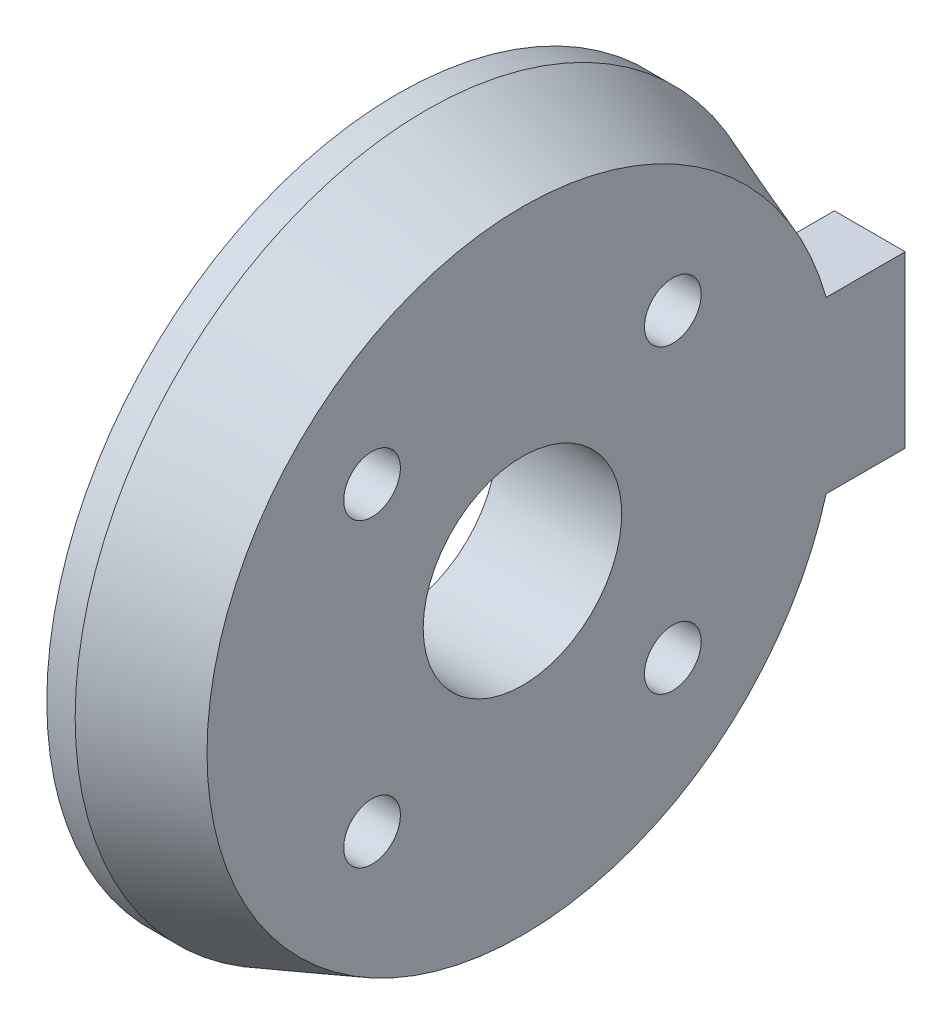
ISO-10303-21;
HEADER;
FILE_DESCRIPTION(('STEP AP214'),'2;1');
FILE_NAME('part.step','',(''),(''),'','','');
FILE_SCHEMA(('AUTOMOTIVE_DESIGN { 1 0 10303 214 1 1 1 1 }'));
ENDSEC;
DATA;
#1=APPLICATION_CONTEXT('core data for automotive mechanical design processes');
#2=APPLICATION_PROTOCOL_DEFINITION('international standard','automotive_design',2000,#1);
#3=PRODUCT_CONTEXT('',#1,'mechanical');
#4=PRODUCT('Part','Part','',(#3));
#5=PRODUCT_RELATED_PRODUCT_CATEGORY('part','',(#4));
#6=PRODUCT_DEFINITION_FORMATION('','',#4);
#7=PRODUCT_DEFINITION_CONTEXT('part definition',#1,'design');
#8=PRODUCT_DEFINITION('design','',#6,#7);
#9=PRODUCT_DEFINITION_SHAPE('','',#8);
#10=(LENGTH_UNIT() NAMED_UNIT(*) SI_UNIT(.MILLI.,.METRE.));
#11=(NAMED_UNIT(*) PLANE_ANGLE_UNIT() SI_UNIT($,.RADIAN.));
#12=(NAMED_UNIT(*) SI_UNIT($,.STERADIAN.) SOLID_ANGLE_UNIT());
#13=UNCERTAINTY_MEASURE_WITH_UNIT(LENGTH_MEASURE(1.E-05),#10,'distance_accuracy_value','');
#14=(GEOMETRIC_REPRESENTATION_CONTEXT(3) GLOBAL_UNCERTAINTY_ASSIGNED_CONTEXT((#13)) GLOBAL_UNIT_ASSIGNED_CONTEXT((#10,
#11,#12)) REPRESENTATION_CONTEXT('',''));
#15=CARTESIAN_POINT('',(0.,0.,0.));
#16=DIRECTION('',(0.,0.,1.));
#17=DIRECTION('',(1.,0.,0.));
#18=AXIS2_PLACEMENT_3D('',#15,#16,#17);
#19=CARTESIAN_POINT('',(0.,7.,0.));
#20=DIRECTION('',(1.,0.,0.));
#21=DIRECTION('',(0.,0.,-1.));
#22=AXIS2_PLACEMENT_3D('',#19,#20,#21);
#23=PLANE('',#22);
#24=CARTESIAN_POINT('',(0.,0.,0.));
#25=DIRECTION('',(-1.,0.,0.));
#26=DIRECTION('',(0.,0.,1.));
#27=AXIS2_PLACEMENT_3D('',#24,#25,#26);
#28=CIRCLE('',#27,7.);
#29=CARTESIAN_POINT('',(0.,0.,7.));
#30=VERTEX_POINT('',#29);
#31=EDGE_CURVE('E537',#30,#30,#28,.T.);
#32=ORIENTED_EDGE('',*,*,#31,.F.);
#33=EDGE_LOOP('',(#32));
#34=FACE_BOUND('',#33,.T.);
#35=CARTESIAN_POINT('',(0.,0.,0.));
#36=DIRECTION('',(-1.,0.,0.));
#37=DIRECTION('',(0.,0.,1.));
#38=AXIS2_PLACEMENT_3D('',#35,#36,#37);
#39=CIRCLE('',#38,24.75);
#40=CARTESIAN_POINT('',(0.,0.,24.75));
#41=VERTEX_POINT('',#40);
#42=EDGE_CURVE('E386',#41,#41,#39,.T.);
#43=ORIENTED_EDGE('',*,*,#42,.T.);
#44=EDGE_LOOP('',(#43));
#45=FACE_BOUND('',#44,.T.);
#46=ADVANCED_FACE('F378',(#34,#45),#23,.F.);
#47=CARTESIAN_POINT('',(0.,0.,0.));
#48=DIRECTION('',(-1.,0.,0.));
#49=DIRECTION('',(0.,0.,1.));
#50=AXIS2_PLACEMENT_3D('',#47,#48,#49);
#51=CYLINDRICAL_SURFACE('',#50,24.75);
#52=ORIENTED_EDGE('',*,*,#42,.F.);
#53=EDGE_LOOP('',(#52));
#54=FACE_BOUND('',#53,.T.);
#55=CARTESIAN_POINT('',(2.,0.,0.));
#56=DIRECTION('',(-1.,0.,0.));
#57=DIRECTION('',(0.,0.,1.));
#58=AXIS2_PLACEMENT_3D('',#55,#56,#57);
#59=CIRCLE('',#58,24.75);
#60=CARTESIAN_POINT('',(2.,0.,24.75));
#61=VERTEX_POINT('',#60);
#62=EDGE_CURVE('E541',#61,#61,#59,.T.);
#63=ORIENTED_EDGE('',*,*,#62,.T.);
#64=EDGE_LOOP('',(#63));
#65=FACE_BOUND('',#64,.T.);
#66=ADVANCED_FACE('F526',(#54,#65),#51,.T.);
#67=CARTESIAN_POINT('',(8.8,0.,0.));
#68=DIRECTION('',(-1.,0.,0.));
#69=DIRECTION('',(0.,0.,1.));
#70=AXIS2_PLACEMENT_3D('',#67,#68,#69);
#71=CONICAL_SURFACE('',#70,22.25,0.352308724674142);
#72=CARTESIAN_POINT('',(8.8,0.,0.));
#73=DIRECTION('',(-1.,0.,0.));
#74=DIRECTION('',(0.,0.,1.));
#75=AXIS2_PLACEMENT_3D('',#72,#73,#74);
#76=CIRCLE('',#75,22.25);
#77=CARTESIAN_POINT('',(8.8,-6.,-21.4257438610658));
#78=VERTEX_POINT('',#77);
#79=CARTESIAN_POINT('',(8.8,6.,-21.4257438610658));
#80=VERTEX_POINT('',#79);
#81=EDGE_CURVE('E545',#78,#80,#76,.T.);
#82=ORIENTED_EDGE('',*,*,#81,.T.);
#83=CARTESIAN_POINT('',(19.7575035004056,6.,-17.2053271783559));
#84=CARTESIAN_POINT('',(18.6390342026549,6.,-17.6407847721388));
#85=CARTESIAN_POINT('',(17.5199812225312,6.,-18.0747394632597));
#86=CARTESIAN_POINT('',(15.2809016229607,6.,-18.9401247539898));
#87=CARTESIAN_POINT('',(14.1608750051132,6.,-19.3715553577363));
#88=CARTESIAN_POINT('',(11.9200463267099,6.,-20.2323724852754));
#89=CARTESIAN_POINT('',(10.7992442718469,6.,-20.661759023896));
#90=CARTESIAN_POINT('',(8.55698840045047,6.,-21.5188280809643));
#91=CARTESIAN_POINT('',(7.43553458361437,6.,-21.9465105986202));
#92=CARTESIAN_POINT('',(4.0703735247917,6.,-23.2274248495122));
#93=CARTESIAN_POINT('',(1.8258557930731,6.,-24.078527454133));
#94=CARTESIAN_POINT('',(-1.54209414362676,6.,-25.3521000782523));
#95=CARTESIAN_POINT('',(-2.66494389793727,6.,-25.7761123256828));
#96=CARTESIAN_POINT('',(-4.91098204274209,6.,-26.6232384360108));
#97=CARTESIAN_POINT('',(-6.03417043317763,6.,-27.0463522990641));
#98=CARTESIAN_POINT('',(-7.15750350040557,6.,-27.4690819374392));
#99=B_SPLINE_CURVE_WITH_KNOTS('',3,(#83,#84,#85,#86,#87,#88,#89,#90,#91,#92,#93,#94,#95,#96,#97,
#98),.UNSPECIFIED.,.F.,.F.,(4,2,2,2,2,2,2,4),(0.,3.60074299673403,7.2014800898162,
10.8021910228473,14.4029036291149,21.604293878824,25.2050160476806,28.8057375920593),.UNSPECIFIED.);
#100=CARTESIAN_POINT('',(3.8,6.,-23.3290179730047));
#101=VERTEX_POINT('',#100);
#102=EDGE_CURVE('E396',#80,#101,#99,.T.);
#103=ORIENTED_EDGE('',*,*,#102,.T.);
#104=CARTESIAN_POINT('',(3.8,0.,0.));
#105=DIRECTION('',(1.,0.,0.));
#106=DIRECTION('',(0.,0.,-1.));
#107=AXIS2_PLACEMENT_3D('',#104,#105,#106);
#108=CIRCLE('',#107,24.0882352941176);
#109=CARTESIAN_POINT('',(3.8,-6.,-23.3290179730047));
#110=VERTEX_POINT('',#109);
#111=EDGE_CURVE('E12',#110,#101,#108,.T.);
#112=ORIENTED_EDGE('',*,*,#111,.F.);
#113=CARTESIAN_POINT('',(-7.15750350040557,-6.,-27.4690819374392));
#114=CARTESIAN_POINT('',(-6.03417043317763,-6.,-27.0463522990641));
#115=CARTESIAN_POINT('',(-4.9109820427421,-6.,-26.6232384360108));
#116=CARTESIAN_POINT('',(-2.66494389793727,-6.,-25.7761123256828));
#117=CARTESIAN_POINT('',(-1.54209414362675,-6.,-25.3521000782523));
#118=CARTESIAN_POINT('',(1.82585579307311,-6.,-24.078527454133));
#119=CARTESIAN_POINT('',(4.0703735247917,-6.,-23.2274248495122));
#120=CARTESIAN_POINT('',(7.43553458361437,-6.,-21.9465105986202));
#121=CARTESIAN_POINT('',(8.55698840045047,-6.,-21.5188280809643));
#122=CARTESIAN_POINT('',(10.7992442718469,-6.,-20.661759023896));
#123=CARTESIAN_POINT('',(11.9200463267099,-6.,-20.2323724852754));
#124=CARTESIAN_POINT('',(14.1608750051132,-6.,-19.3715553577363));
#125=CARTESIAN_POINT('',(15.2809016229607,-6.,-18.9401247539898));
#126=CARTESIAN_POINT('',(17.5199812225312,-6.,-18.0747394632597));
#127=CARTESIAN_POINT('',(18.6390342026549,-6.,-17.6407847721388));
#128=CARTESIAN_POINT('',(19.7575035004056,-6.,-17.2053271783559));
#129=B_SPLINE_CURVE_WITH_KNOTS('',3,(#113,#114,#115,#116,#117,#118,#119,#120,#121,#122,#123,
#124,#125,#126,#127,#128),.UNSPECIFIED.,.F.,.F.,(4,2,2,2,2,2,2,4),(0.,3.60072154437864,
7.2014437132353,14.4028339629443,18.003546569212,21.6042575022431,25.2049945953252,
28.8057375920593),.UNSPECIFIED.);
#130=EDGE_CURVE('E429',#110,#78,#129,.T.);
#131=ORIENTED_EDGE('',*,*,#130,.T.);
#132=EDGE_LOOP('',(#82,#103,#112,#131));
#133=FACE_BOUND('',#132,.T.);
#134=ORIENTED_EDGE('',*,*,#62,.F.);
#135=EDGE_LOOP('',(#134));
#136=FACE_BOUND('',#135,.T.);
#137=ADVANCED_FACE('F477',(#133,#136),#71,.T.);
#138=CARTESIAN_POINT('',(8.8,22.25,0.));
#139=DIRECTION('',(-1.,0.,0.));
#140=DIRECTION('',(0.,0.,1.));
#141=AXIS2_PLACEMENT_3D('',#138,#139,#140);
#142=PLANE('',#141);
#143=ORIENTED_EDGE('',*,*,#81,.F.);
#144=DIRECTION('',(0.,0.,-1.));
#145=VECTOR('',#144,1.);
#146=CARTESIAN_POINT('',(8.8,-6.,-15.));
#147=LINE('',#146,#145);
#148=CARTESIAN_POINT('',(8.8,-6.,-27.));
#149=VERTEX_POINT('',#148);
#150=EDGE_CURVE('E454',#78,#149,#147,.T.);
#151=ORIENTED_EDGE('',*,*,#150,.T.);
#152=DIRECTION('',(0.,1.,0.));
#153=VECTOR('',#152,1.);
#154=CARTESIAN_POINT('',(8.8,6.,-27.));
#155=LINE('',#154,#153);
#156=CARTESIAN_POINT('',(8.8,6.,-27.));
#157=VERTEX_POINT('',#156);
#158=EDGE_CURVE('E441',#149,#157,#155,.T.);
#159=ORIENTED_EDGE('',*,*,#158,.T.);
#160=DIRECTION('',(0.,0.,1.));
#161=VECTOR('',#160,1.);
#162=CARTESIAN_POINT('',(8.8,6.,-15.));
#163=LINE('',#162,#161);
#164=EDGE_CURVE('E434',#157,#80,#163,.T.);
#165=ORIENTED_EDGE('',*,*,#164,.T.);
#166=EDGE_LOOP('',(#143,#151,#159,#165));
#167=FACE_BOUND('',#166,.T.);
#168=CARTESIAN_POINT('',(8.8,10.6066017177976,10.6066017177982));
#169=DIRECTION('',(1.,0.,0.));
#170=DIRECTION('',(0.,0.,-1.));
#171=AXIS2_PLACEMENT_3D('',#168,#169,#170);
#172=CIRCLE('',#171,2.00000000000064);
#173=CARTESIAN_POINT('',(8.8,10.6066017177976,8.60660171779759));
#174=VERTEX_POINT('',#173);
#175=EDGE_CURVE('E568',#174,#174,#172,.T.);
#176=ORIENTED_EDGE('',*,*,#175,.F.);
#177=EDGE_LOOP('',(#176));
#178=FACE_BOUND('',#177,.T.);
#179=CARTESIAN_POINT('',(8.8,-10.6066017177988,10.6066017177976));
#180=DIRECTION('',(1.,0.,0.));
#181=DIRECTION('',(0.,0.,-1.));
#182=AXIS2_PLACEMENT_3D('',#179,#180,#181);
#183=CIRCLE('',#182,2.00000000000045);
#184=CARTESIAN_POINT('',(8.8,-10.6066017177988,8.60660171779715));
#185=VERTEX_POINT('',#184);
#186=EDGE_CURVE('E576',#185,#185,#183,.T.);
#187=ORIENTED_EDGE('',*,*,#186,.F.);
#188=EDGE_LOOP('',(#187));
#189=FACE_BOUND('',#188,.T.);
#190=CARTESIAN_POINT('',(8.8,-10.6066017177982,-10.6066017177988));
#191=DIRECTION('',(1.,0.,0.));
#192=DIRECTION('',(0.,0.,-1.));
#193=AXIS2_PLACEMENT_3D('',#190,#191,#192);
#194=CIRCLE('',#193,1.99999999999985);
#195=CARTESIAN_POINT('',(8.8,-10.6066017177982,-12.6066017177987));
#196=VERTEX_POINT('',#195);
#197=EDGE_CURVE('E561',#196,#196,#194,.T.);
#198=ORIENTED_EDGE('',*,*,#197,.F.);
#199=EDGE_LOOP('',(#198));
#200=FACE_BOUND('',#199,.T.);
#201=CARTESIAN_POINT('',(8.8,10.6066017177982,-10.6066017177982));
#202=DIRECTION('',(1.,0.,0.));
#203=DIRECTION('',(0.,0.,-1.));
#204=AXIS2_PLACEMENT_3D('',#201,#202,#203);
#205=CIRCLE('',#204,2.);
#206=CARTESIAN_POINT('',(8.8,10.6066017177982,-12.6066017177982));
#207=VERTEX_POINT('',#206);
#208=EDGE_CURVE('E557',#207,#207,#205,.T.);
#209=ORIENTED_EDGE('',*,*,#208,.F.);
#210=EDGE_LOOP('',(#209));
#211=FACE_BOUND('',#210,.T.);
#212=CARTESIAN_POINT('',(8.8,0.,0.));
#213=DIRECTION('',(-1.,0.,0.));
#214=DIRECTION('',(0.,0.,1.));
#215=AXIS2_PLACEMENT_3D('',#212,#213,#214);
#216=CIRCLE('',#215,7.);
#217=CARTESIAN_POINT('',(8.8,0.,7.));
#218=VERTEX_POINT('',#217);
#219=EDGE_CURVE('E550',#218,#218,#216,.T.);
#220=ORIENTED_EDGE('',*,*,#219,.T.);
#221=EDGE_LOOP('',(#220));
#222=FACE_BOUND('',#221,.T.);
#223=ADVANCED_FACE('F519',(#167,#178,#189,#200,#211,#222),#142,.F.);
#224=CARTESIAN_POINT('',(0.,0.,0.));
#225=DIRECTION('',(-1.,0.,0.));
#226=DIRECTION('',(0.,0.,1.));
#227=AXIS2_PLACEMENT_3D('',#224,#225,#226);
#228=CYLINDRICAL_SURFACE('',#227,7.);
#229=ORIENTED_EDGE('',*,*,#219,.F.);
#230=EDGE_LOOP('',(#229));
#231=FACE_BOUND('',#230,.T.);
#232=ORIENTED_EDGE('',*,*,#31,.T.);
#233=EDGE_LOOP('',(#232));
#234=FACE_BOUND('',#233,.T.);
#235=ADVANCED_FACE('F516',(#231,#234),#228,.F.);
#236=CARTESIAN_POINT('',(3.8,10.6066017177982,-10.6066017177982));
#237=DIRECTION('',(1.,0.,0.));
#238=DIRECTION('',(0.,0.,-1.));
#239=AXIS2_PLACEMENT_3D('',#236,#237,#238);
#240=CYLINDRICAL_SURFACE('',#239,2.);
#241=CARTESIAN_POINT('',(3.8,10.6066017177982,-10.6066017177982));
#242=DIRECTION('',(1.,0.,0.));
#243=DIRECTION('',(0.,0.,-1.));
#244=AXIS2_PLACEMENT_3D('',#241,#242,#243);
#245=CIRCLE('',#244,2.);
#246=CARTESIAN_POINT('',(3.8,10.6066017177982,-12.6066017177982));
#247=VERTEX_POINT('',#246);
#248=EDGE_CURVE('E556',#247,#247,#245,.T.);
#249=ORIENTED_EDGE('',*,*,#248,.F.);
#250=EDGE_LOOP('',(#249));
#251=FACE_BOUND('',#250,.T.);
#252=ORIENTED_EDGE('',*,*,#208,.T.);
#253=EDGE_LOOP('',(#252));
#254=FACE_BOUND('',#253,.T.);
#255=ADVANCED_FACE('F512',(#251,#254),#240,.F.);
#256=CARTESIAN_POINT('',(3.8,10.6066017177982,-10.6066017177982));
#257=DIRECTION('',(1.,0.,0.));
#258=DIRECTION('',(0.,0.,-1.));
#259=AXIS2_PLACEMENT_3D('',#256,#257,#258);
#260=PLANE('',#259);
#261=ORIENTED_EDGE('',*,*,#248,.T.);
#262=EDGE_LOOP('',(#261));
#263=FACE_BOUND('',#262,.T.);
#264=ADVANCED_FACE('F489',(#263),#260,.T.);
#265=CARTESIAN_POINT('',(3.8,-10.6066017177982,-10.6066017177988));
#266=DIRECTION('',(1.,0.,0.));
#267=DIRECTION('',(0.,0.,-1.));
#268=AXIS2_PLACEMENT_3D('',#265,#266,#267);
#269=CYLINDRICAL_SURFACE('',#268,1.99999999999985);
#270=CARTESIAN_POINT('',(3.8,-10.6066017177982,-10.6066017177988));
#271=DIRECTION('',(1.,0.,0.));
#272=DIRECTION('',(0.,0.,-1.));
#273=AXIS2_PLACEMENT_3D('',#270,#271,#272);
#274=CIRCLE('',#273,1.99999999999985);
#275=CARTESIAN_POINT('',(3.8,-10.6066017177982,-12.6066017177987));
#276=VERTEX_POINT('',#275);
#277=EDGE_CURVE('E580',#276,#276,#274,.T.);
#278=ORIENTED_EDGE('',*,*,#277,.F.);
#279=EDGE_LOOP('',(#278));
#280=FACE_BOUND('',#279,.T.);
#281=ORIENTED_EDGE('',*,*,#197,.T.);
#282=EDGE_LOOP('',(#281));
#283=FACE_BOUND('',#282,.T.);
#284=ADVANCED_FACE('F485',(#280,#283),#269,.F.);
#285=CARTESIAN_POINT('',(3.8,-10.6066017177982,-10.6066017177988));
#286=DIRECTION('',(1.,0.,0.));
#287=DIRECTION('',(0.,0.,-1.));
#288=AXIS2_PLACEMENT_3D('',#285,#286,#287);
#289=PLANE('',#288);
#290=ORIENTED_EDGE('',*,*,#277,.T.);
#291=EDGE_LOOP('',(#290));
#292=FACE_BOUND('',#291,.T.);
#293=ADVANCED_FACE('F488',(#292),#289,.T.);
#294=CARTESIAN_POINT('',(3.8,-10.6066017177988,10.6066017177976));
#295=DIRECTION('',(1.,0.,0.));
#296=DIRECTION('',(0.,0.,-1.));
#297=AXIS2_PLACEMENT_3D('',#294,#295,#296);
#298=CYLINDRICAL_SURFACE('',#297,2.00000000000045);
#299=CARTESIAN_POINT('',(3.8,-10.6066017177988,10.6066017177976));
#300=DIRECTION('',(1.,0.,0.));
#301=DIRECTION('',(0.,0.,-1.));
#302=AXIS2_PLACEMENT_3D('',#299,#300,#301);
#303=CIRCLE('',#302,2.00000000000045);
#304=CARTESIAN_POINT('',(3.8,-10.6066017177988,8.60660171779715));
#305=VERTEX_POINT('',#304);
#306=EDGE_CURVE('E572',#305,#305,#303,.T.);
#307=ORIENTED_EDGE('',*,*,#306,.F.);
#308=EDGE_LOOP('',(#307));
#309=FACE_BOUND('',#308,.T.);
#310=ORIENTED_EDGE('',*,*,#186,.T.);
#311=EDGE_LOOP('',(#310));
#312=FACE_BOUND('',#311,.T.);
#313=ADVANCED_FACE('F493',(#309,#312),#298,.F.);
#314=CARTESIAN_POINT('',(3.8,-10.6066017177988,10.6066017177976));
#315=DIRECTION('',(1.,0.,0.));
#316=DIRECTION('',(0.,0.,-1.));
#317=AXIS2_PLACEMENT_3D('',#314,#315,#316);
#318=PLANE('',#317);
#319=ORIENTED_EDGE('',*,*,#306,.T.);
#320=EDGE_LOOP('',(#319));
#321=FACE_BOUND('',#320,.T.);
#322=ADVANCED_FACE('F497',(#321),#318,.T.);
#323=CARTESIAN_POINT('',(3.8,10.6066017177976,10.6066017177982));
#324=DIRECTION('',(1.,0.,0.));
#325=DIRECTION('',(0.,0.,-1.));
#326=AXIS2_PLACEMENT_3D('',#323,#324,#325);
#327=CYLINDRICAL_SURFACE('',#326,2.00000000000064);
#328=CARTESIAN_POINT('',(3.8,10.6066017177976,10.6066017177982));
#329=DIRECTION('',(1.,0.,0.));
#330=DIRECTION('',(0.,0.,-1.));
#331=AXIS2_PLACEMENT_3D('',#328,#329,#330);
#332=CIRCLE('',#331,2.00000000000064);
#333=CARTESIAN_POINT('',(3.8,10.6066017177976,8.60660171779759));
#334=VERTEX_POINT('',#333);
#335=EDGE_CURVE('E565',#334,#334,#332,.T.);
#336=ORIENTED_EDGE('',*,*,#335,.F.);
#337=EDGE_LOOP('',(#336));
#338=FACE_BOUND('',#337,.T.);
#339=ORIENTED_EDGE('',*,*,#175,.T.);
#340=EDGE_LOOP('',(#339));
#341=FACE_BOUND('',#340,.T.);
#342=ADVANCED_FACE('F501',(#338,#341),#327,.F.);
#343=CARTESIAN_POINT('',(3.8,10.6066017177976,10.6066017177982));
#344=DIRECTION('',(1.,0.,0.));
#345=DIRECTION('',(0.,0.,-1.));
#346=AXIS2_PLACEMENT_3D('',#343,#344,#345);
#347=PLANE('',#346);
#348=ORIENTED_EDGE('',*,*,#335,.T.);
#349=EDGE_LOOP('',(#348));
#350=FACE_BOUND('',#349,.T.);
#351=ADVANCED_FACE('F505',(#350),#347,.T.);
#352=CARTESIAN_POINT('',(3.8,6.,-15.));
#353=DIRECTION('',(0.,1.,0.));
#354=DIRECTION('',(0.,0.,1.));
#355=AXIS2_PLACEMENT_3D('',#352,#353,#354);
#356=PLANE('',#355);
#357=ORIENTED_EDGE('',*,*,#102,.F.);
#358=ORIENTED_EDGE('',*,*,#164,.F.);
#359=DIRECTION('',(1.,0.,0.));
#360=VECTOR('',#359,1.);
#361=CARTESIAN_POINT('',(3.8,6.,-27.));
#362=LINE('',#361,#360);
#363=CARTESIAN_POINT('',(3.8,6.,-27.));
#364=VERTEX_POINT('',#363);
#365=EDGE_CURVE('E443',#364,#157,#362,.T.);
#366=ORIENTED_EDGE('',*,*,#365,.F.);
#367=DIRECTION('',(0.,0.,1.));
#368=VECTOR('',#367,1.);
#369=CARTESIAN_POINT('',(3.8,6.,-15.));
#370=LINE('',#369,#368);
#371=EDGE_CURVE('E444',#364,#101,#370,.T.);
#372=ORIENTED_EDGE('',*,*,#371,.T.);
#373=EDGE_LOOP('',(#357,#358,#366,#372));
#374=FACE_BOUND('',#373,.T.);
#375=ADVANCED_FACE('F484',(#374),#356,.T.);
#376=CARTESIAN_POINT('',(3.8,-6.,-15.));
#377=DIRECTION('',(0.,-1.,0.));
#378=DIRECTION('',(0.,0.,-1.));
#379=AXIS2_PLACEMENT_3D('',#376,#377,#378);
#380=PLANE('',#379);
#381=ORIENTED_EDGE('',*,*,#130,.F.);
#382=DIRECTION('',(0.,0.,-1.));
#383=VECTOR('',#382,1.);
#384=CARTESIAN_POINT('',(3.8,-6.,-15.));
#385=LINE('',#384,#383);
#386=CARTESIAN_POINT('',(3.8,-6.,-27.));
#387=VERTEX_POINT('',#386);
#388=EDGE_CURVE('E423',#110,#387,#385,.T.);
#389=ORIENTED_EDGE('',*,*,#388,.T.);
#390=DIRECTION('',(1.,0.,0.));
#391=VECTOR('',#390,1.);
#392=CARTESIAN_POINT('',(3.8,-6.,-27.));
#393=LINE('',#392,#391);
#394=EDGE_CURVE('E427',#387,#149,#393,.T.);
#395=ORIENTED_EDGE('',*,*,#394,.T.);
#396=ORIENTED_EDGE('',*,*,#150,.F.);
#397=EDGE_LOOP('',(#381,#389,#395,#396));
#398=FACE_BOUND('',#397,.T.);
#399=ADVANCED_FACE('F425',(#398),#380,.T.);
#400=CARTESIAN_POINT('',(3.8,6.,-27.));
#401=DIRECTION('',(0.,0.,-1.));
#402=DIRECTION('',(-1.,0.,0.));
#403=AXIS2_PLACEMENT_3D('',#400,#401,#402);
#404=PLANE('',#403);
#405=ORIENTED_EDGE('',*,*,#158,.F.);
#406=ORIENTED_EDGE('',*,*,#394,.F.);
#407=DIRECTION('',(0.,1.,0.));
#408=VECTOR('',#407,1.);
#409=CARTESIAN_POINT('',(3.8,6.,-27.));
#410=LINE('',#409,#408);
#411=EDGE_CURVE('E433',#387,#364,#410,.T.);
#412=ORIENTED_EDGE('',*,*,#411,.T.);
#413=ORIENTED_EDGE('',*,*,#365,.T.);
#414=EDGE_LOOP('',(#405,#406,#412,#413));
#415=FACE_BOUND('',#414,.T.);
#416=ADVANCED_FACE('F438',(#415),#404,.T.);
#417=CARTESIAN_POINT('',(3.8,0.,0.));
#418=DIRECTION('',(1.,0.,0.));
#419=DIRECTION('',(0.,0.,-1.));
#420=AXIS2_PLACEMENT_3D('',#417,#418,#419);
#421=PLANE('',#420);
#422=ORIENTED_EDGE('',*,*,#388,.F.);
#423=ORIENTED_EDGE('',*,*,#111,.T.);
#424=ORIENTED_EDGE('',*,*,#371,.F.);
#425=ORIENTED_EDGE('',*,*,#411,.F.);
#426=EDGE_LOOP('',(#422,#423,#424,#425));
#427=FACE_BOUND('',#426,.T.);
#428=ADVANCED_FACE('F446',(#427),#421,.F.);
#429=CLOSED_SHELL('',(#46,#66,#137,#223,#235,#255,#264,#284,#293,#313,#322,#342,#351,#375,#399,
#416,#428));
#430=MANIFOLD_SOLID_BREP('B2',#429);
#431=ADVANCED_BREP_SHAPE_REPRESENTATION('',(#18,#430),#14);
#432=SHAPE_DEFINITION_REPRESENTATION(#9,#431);
ENDSEC;
END-ISO-10303-21;
